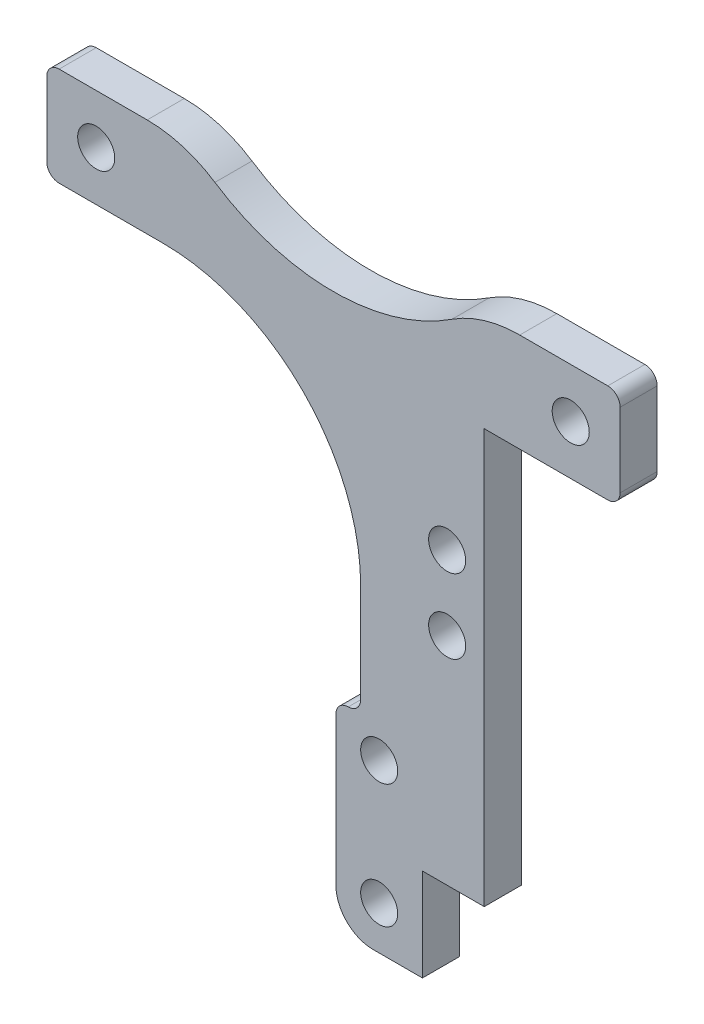
ISO-10303-21;
HEADER;
FILE_DESCRIPTION(('STEP AP214'),'2;1');
FILE_NAME('part.step','',(''),(''),'','','');
FILE_SCHEMA(('AUTOMOTIVE_DESIGN { 1 0 10303 214 1 1 1 1 }'));
ENDSEC;
DATA;
#1=APPLICATION_CONTEXT('core data for automotive mechanical design processes');
#2=APPLICATION_PROTOCOL_DEFINITION('international standard','automotive_design',2000,#1);
#3=PRODUCT_CONTEXT('',#1,'mechanical');
#4=PRODUCT('Part','Part','',(#3));
#5=PRODUCT_RELATED_PRODUCT_CATEGORY('part','',(#4));
#6=PRODUCT_DEFINITION_FORMATION('','',#4);
#7=PRODUCT_DEFINITION_CONTEXT('part definition',#1,'design');
#8=PRODUCT_DEFINITION('design','',#6,#7);
#9=PRODUCT_DEFINITION_SHAPE('','',#8);
#10=(LENGTH_UNIT() NAMED_UNIT(*) SI_UNIT(.MILLI.,.METRE.));
#11=(NAMED_UNIT(*) PLANE_ANGLE_UNIT() SI_UNIT($,.RADIAN.));
#12=(NAMED_UNIT(*) SI_UNIT($,.STERADIAN.) SOLID_ANGLE_UNIT());
#13=UNCERTAINTY_MEASURE_WITH_UNIT(LENGTH_MEASURE(1.E-05),#10,'distance_accuracy_value','');
#14=(GEOMETRIC_REPRESENTATION_CONTEXT(3) GLOBAL_UNCERTAINTY_ASSIGNED_CONTEXT((#13)) GLOBAL_UNIT_ASSIGNED_CONTEXT((#10,
#11,#12)) REPRESENTATION_CONTEXT('',''));
#15=CARTESIAN_POINT('',(0.,0.,0.));
#16=DIRECTION('',(0.,0.,1.));
#17=DIRECTION('',(1.,0.,0.));
#18=AXIS2_PLACEMENT_3D('',#15,#16,#17);
#19=CARTESIAN_POINT('',(11.,55.,3.));
#20=DIRECTION('',(0.,-1.,0.));
#21=DIRECTION('',(0.,0.,-1.));
#22=AXIS2_PLACEMENT_3D('',#19,#20,#21);
#23=PLANE('',#22);
#24=DIRECTION('',(-1.,0.,0.));
#25=VECTOR('',#24,1.);
#26=CARTESIAN_POINT('',(11.,55.,0.));
#27=LINE('',#26,#25);
#28=CARTESIAN_POINT('',(10.,55.,0.));
#29=VERTEX_POINT('',#28);
#30=CARTESIAN_POINT('',(2.87481343168134,55.,0.));
#31=VERTEX_POINT('',#30);
#32=EDGE_CURVE('E289',#29,#31,#27,.T.);
#33=ORIENTED_EDGE('',*,*,#32,.T.);
#34=DIRECTION('',(0.,0.,1.));
#35=VECTOR('',#34,1.);
#36=CARTESIAN_POINT('',(2.87481343168134,55.,3.));
#37=LINE('',#36,#35);
#38=CARTESIAN_POINT('',(2.87481343168134,55.,3.));
#39=VERTEX_POINT('',#38);
#40=EDGE_CURVE('E370',#31,#39,#37,.T.);
#41=ORIENTED_EDGE('',*,*,#40,.T.);
#42=DIRECTION('',(-1.,0.,0.));
#43=VECTOR('',#42,1.);
#44=CARTESIAN_POINT('',(11.,55.,3.));
#45=LINE('',#44,#43);
#46=CARTESIAN_POINT('',(10.,55.,3.));
#47=VERTEX_POINT('',#46);
#48=EDGE_CURVE('E263',#47,#39,#45,.T.);
#49=ORIENTED_EDGE('',*,*,#48,.F.);
#50=DIRECTION('',(0.,0.,-1.));
#51=VECTOR('',#50,1.);
#52=CARTESIAN_POINT('',(10.,55.,3.));
#53=LINE('',#52,#51);
#54=EDGE_CURVE('E310',#47,#29,#53,.T.);
#55=ORIENTED_EDGE('',*,*,#54,.T.);
#56=EDGE_LOOP('',(#33,#41,#49,#55));
#57=FACE_BOUND('',#56,.T.);
#58=ADVANCED_FACE('F34',(#57),#23,.F.);
#59=CARTESIAN_POINT('',(0.,0.,3.));
#60=DIRECTION('',(0.,0.,-1.));
#61=DIRECTION('',(-1.,0.,0.));
#62=AXIS2_PLACEMENT_3D('',#59,#60,#61);
#63=PLANE('',#62);
#64=CARTESIAN_POINT('',(-3.00000000002149,30.9999999999888,3.));
#65=DIRECTION('',(0.,0.,1.));
#66=DIRECTION('',(1.,0.,0.));
#67=AXIS2_PLACEMENT_3D('',#64,#65,#66);
#68=CIRCLE('',#67,1.5);
#69=CARTESIAN_POINT('',(-1.50000000002149,30.9999999999888,3.));
#70=VERTEX_POINT('',#69);
#71=EDGE_CURVE('E393',#70,#70,#68,.T.);
#72=ORIENTED_EDGE('',*,*,#71,.F.);
#73=EDGE_LOOP('',(#72));
#74=FACE_BOUND('',#73,.T.);
#75=CARTESIAN_POINT('',(-3.00000000002151,36.9999999999888,3.));
#76=DIRECTION('',(0.,0.,1.));
#77=DIRECTION('',(1.,0.,0.));
#78=AXIS2_PLACEMENT_3D('',#75,#76,#77);
#79=CIRCLE('',#78,1.5);
#80=CARTESIAN_POINT('',(-1.50000000002152,36.9999999999888,3.));
#81=VERTEX_POINT('',#80);
#82=EDGE_CURVE('E219',#81,#81,#79,.T.);
#83=ORIENTED_EDGE('',*,*,#82,.F.);
#84=EDGE_LOOP('',(#83));
#85=FACE_BOUND('',#84,.T.);
#86=DIRECTION('',(0.,-1.,0.));
#87=VECTOR('',#86,1.);
#88=CARTESIAN_POINT('',(-12.,7.,3.));
#89=LINE('',#88,#87);
#90=CARTESIAN_POINT('',(-12.,21.,3.));
#91=VERTEX_POINT('',#90);
#92=CARTESIAN_POINT('',(-12.,9.,3.));
#93=VERTEX_POINT('',#92);
#94=EDGE_CURVE('E274',#91,#93,#89,.T.);
#95=ORIENTED_EDGE('',*,*,#94,.T.);
#96=CARTESIAN_POINT('',(-9.,9.,3.));
#97=DIRECTION('',(0.,0.,-1.));
#98=DIRECTION('',(-1.,0.,0.));
#99=AXIS2_PLACEMENT_3D('',#96,#97,#98);
#100=CIRCLE('',#99,3.);
#101=CARTESIAN_POINT('',(-9.,6.,3.));
#102=VERTEX_POINT('',#101);
#103=EDGE_CURVE('E11',#93,#102,#100,.F.);
#104=ORIENTED_EDGE('',*,*,#103,.T.);
#105=DIRECTION('',(-1.,0.,0.));
#106=VECTOR('',#105,1.);
#107=CARTESIAN_POINT('',(-5.,6.,3.));
#108=LINE('',#107,#106);
#109=CARTESIAN_POINT('',(-5.,6.,3.));
#110=VERTEX_POINT('',#109);
#111=EDGE_CURVE('E208',#110,#102,#108,.T.);
#112=ORIENTED_EDGE('',*,*,#111,.F.);
#113=DIRECTION('',(0.,1.,0.));
#114=VECTOR('',#113,1.);
#115=CARTESIAN_POINT('',(-5.,3.5,3.));
#116=LINE('',#115,#114);
#117=CARTESIAN_POINT('',(-5.,13.5,3.));
#118=VERTEX_POINT('',#117);
#119=EDGE_CURVE('E191',#110,#118,#116,.T.);
#120=ORIENTED_EDGE('',*,*,#119,.T.);
#121=DIRECTION('',(1.,0.,0.));
#122=VECTOR('',#121,1.);
#123=CARTESIAN_POINT('',(-5.,13.5,3.));
#124=LINE('',#123,#122);
#125=CARTESIAN_POINT('',(0.,13.5,3.));
#126=VERTEX_POINT('',#125);
#127=EDGE_CURVE('E201',#118,#126,#124,.T.);
#128=ORIENTED_EDGE('',*,*,#127,.T.);
#129=DIRECTION('',(0.,1.,0.));
#130=VECTOR('',#129,1.);
#131=CARTESIAN_POINT('',(0.,13.5,3.));
#132=LINE('',#131,#130);
#133=CARTESIAN_POINT('',(0.,47.,3.));
#134=VERTEX_POINT('',#133);
#135=EDGE_CURVE('E254',#126,#134,#132,.T.);
#136=ORIENTED_EDGE('',*,*,#135,.T.);
#137=DIRECTION('',(1.,0.,0.));
#138=VECTOR('',#137,1.);
#139=CARTESIAN_POINT('',(0.,47.,3.));
#140=LINE('',#139,#138);
#141=CARTESIAN_POINT('',(10.,47.,3.));
#142=VERTEX_POINT('',#141);
#143=EDGE_CURVE('E256',#134,#142,#140,.T.);
#144=ORIENTED_EDGE('',*,*,#143,.T.);
#145=CARTESIAN_POINT('',(10.,48.,3.));
#146=DIRECTION('',(0.,0.,-1.));
#147=DIRECTION('',(-1.,0.,0.));
#148=AXIS2_PLACEMENT_3D('',#145,#146,#147);
#149=CIRCLE('',#148,1.);
#150=CARTESIAN_POINT('',(11.,48.,3.));
#151=VERTEX_POINT('',#150);
#152=EDGE_CURVE('E335',#142,#151,#149,.F.);
#153=ORIENTED_EDGE('',*,*,#152,.T.);
#154=DIRECTION('',(0.,1.,0.));
#155=VECTOR('',#154,1.);
#156=CARTESIAN_POINT('',(11.,47.,3.));
#157=LINE('',#156,#155);
#158=CARTESIAN_POINT('',(11.,54.,3.));
#159=VERTEX_POINT('',#158);
#160=EDGE_CURVE('E259',#151,#159,#157,.T.);
#161=ORIENTED_EDGE('',*,*,#160,.T.);
#162=CARTESIAN_POINT('',(10.,54.,3.));
#163=DIRECTION('',(0.,0.,-1.));
#164=DIRECTION('',(-1.,0.,0.));
#165=AXIS2_PLACEMENT_3D('',#162,#163,#164);
#166=CIRCLE('',#165,1.);
#167=EDGE_CURVE('E337',#159,#47,#166,.F.);
#168=ORIENTED_EDGE('',*,*,#167,.T.);
#169=ORIENTED_EDGE('',*,*,#48,.T.);
#170=CARTESIAN_POINT('',(2.87481343168134,45.,3.));
#171=DIRECTION('',(0.,0.,-1.));
#172=DIRECTION('',(-1.,0.,0.));
#173=AXIS2_PLACEMENT_3D('',#170,#171,#172);
#174=CIRCLE('',#173,10.);
#175=CARTESIAN_POINT('',(-2.60693690711188,53.3636363636364,3.));
#176=VERTEX_POINT('',#175);
#177=EDGE_CURVE('E375',#39,#176,#174,.F.);
#178=ORIENTED_EDGE('',*,*,#177,.T.);
#179=CARTESIAN_POINT('',(-12.2,68.,3.));
#180=DIRECTION('',(0.,0.,1.));
#181=DIRECTION('',(1.,0.,0.));
#182=AXIS2_PLACEMENT_3D('',#179,#180,#181);
#183=CIRCLE('',#182,17.5);
#184=CARTESIAN_POINT('',(-21.7930630928881,53.3636363636364,3.));
#185=VERTEX_POINT('',#184);
#186=EDGE_CURVE('E211',#185,#176,#183,.T.);
#187=ORIENTED_EDGE('',*,*,#186,.F.);
#188=CARTESIAN_POINT('',(-27.2748134316813,45.,3.));
#189=DIRECTION('',(0.,0.,-1.));
#190=DIRECTION('',(-1.,0.,0.));
#191=AXIS2_PLACEMENT_3D('',#188,#189,#190);
#192=CIRCLE('',#191,10.);
#193=CARTESIAN_POINT('',(-27.2748134316813,55.,3.));
#194=VERTEX_POINT('',#193);
#195=EDGE_CURVE('E373',#185,#194,#192,.F.);
#196=ORIENTED_EDGE('',*,*,#195,.T.);
#197=CARTESIAN_POINT('',(-34.4,55.,3.));
#198=VERTEX_POINT('',#197);
#199=EDGE_CURVE('E262',#194,#198,#45,.T.);
#200=ORIENTED_EDGE('',*,*,#199,.T.);
#201=CARTESIAN_POINT('',(-34.4,54.,3.));
#202=DIRECTION('',(0.,0.,-1.));
#203=DIRECTION('',(-1.,0.,0.));
#204=AXIS2_PLACEMENT_3D('',#201,#202,#203);
#205=CIRCLE('',#204,1.);
#206=CARTESIAN_POINT('',(-35.4,54.,3.));
#207=VERTEX_POINT('',#206);
#208=EDGE_CURVE('E331',#198,#207,#205,.F.);
#209=ORIENTED_EDGE('',*,*,#208,.T.);
#210=DIRECTION('',(0.,-1.,0.));
#211=VECTOR('',#210,1.);
#212=CARTESIAN_POINT('',(-35.4,55.,3.));
#213=LINE('',#212,#211);
#214=CARTESIAN_POINT('',(-35.4,48.,3.));
#215=VERTEX_POINT('',#214);
#216=EDGE_CURVE('E266',#207,#215,#213,.T.);
#217=ORIENTED_EDGE('',*,*,#216,.T.);
#218=CARTESIAN_POINT('',(-34.4,48.,3.));
#219=DIRECTION('',(0.,0.,-1.));
#220=DIRECTION('',(-1.,0.,0.));
#221=AXIS2_PLACEMENT_3D('',#218,#219,#220);
#222=CIRCLE('',#221,1.);
#223=CARTESIAN_POINT('',(-34.4,47.,3.));
#224=VERTEX_POINT('',#223);
#225=EDGE_CURVE('E333',#215,#224,#222,.F.);
#226=ORIENTED_EDGE('',*,*,#225,.T.);
#227=DIRECTION('',(1.,0.,0.));
#228=VECTOR('',#227,1.);
#229=CARTESIAN_POINT('',(-10.,47.,3.));
#230=LINE('',#229,#228);
#231=CARTESIAN_POINT('',(-26.,47.,3.));
#232=VERTEX_POINT('',#231);
#233=EDGE_CURVE('E269',#224,#232,#230,.T.);
#234=ORIENTED_EDGE('',*,*,#233,.T.);
#235=CARTESIAN_POINT('',(-26.,31.,3.));
#236=DIRECTION('',(0.,0.,-1.));
#237=DIRECTION('',(-1.,0.,0.));
#238=AXIS2_PLACEMENT_3D('',#235,#236,#237);
#239=CIRCLE('',#238,16.);
#240=CARTESIAN_POINT('',(-10.,31.,3.));
#241=VERTEX_POINT('',#240);
#242=EDGE_CURVE('E368',#232,#241,#239,.T.);
#243=ORIENTED_EDGE('',*,*,#242,.T.);
#244=DIRECTION('',(0.,-1.,0.));
#245=VECTOR('',#244,1.);
#246=CARTESIAN_POINT('',(-10.,22.,3.));
#247=LINE('',#246,#245);
#248=CARTESIAN_POINT('',(-10.,23.,3.));
#249=VERTEX_POINT('',#248);
#250=EDGE_CURVE('E272',#241,#249,#247,.T.);
#251=ORIENTED_EDGE('',*,*,#250,.T.);
#252=CARTESIAN_POINT('',(-11.,23.,3.));
#253=DIRECTION('',(0.,0.,-1.));
#254=DIRECTION('',(-1.,0.,0.));
#255=AXIS2_PLACEMENT_3D('',#252,#253,#254);
#256=CIRCLE('',#255,1.);
#257=CARTESIAN_POINT('',(-11.,22.,3.));
#258=VERTEX_POINT('',#257);
#259=EDGE_CURVE('E357',#249,#258,#256,.T.);
#260=ORIENTED_EDGE('',*,*,#259,.T.);
#261=CARTESIAN_POINT('',(-11.,21.,3.));
#262=DIRECTION('',(0.,0.,-1.));
#263=DIRECTION('',(-1.,0.,0.));
#264=AXIS2_PLACEMENT_3D('',#261,#262,#263);
#265=CIRCLE('',#264,1.);
#266=EDGE_CURVE('E329',#258,#91,#265,.F.);
#267=ORIENTED_EDGE('',*,*,#266,.T.);
#268=EDGE_LOOP('',(#95,#104,#112,#120,#128,#136,#144,#153,#161,#168,#169,#178,#187,#196,#200,
#209,#217,#226,#234,#243,#251,#260,#267));
#269=FACE_BOUND('',#268,.T.);
#270=CARTESIAN_POINT('',(7.,51.,3.));
#271=DIRECTION('',(0.,0.,1.));
#272=DIRECTION('',(1.,0.,0.));
#273=AXIS2_PLACEMENT_3D('',#270,#271,#272);
#274=CIRCLE('',#273,1.5);
#275=CARTESIAN_POINT('',(8.5,51.,3.));
#276=VERTEX_POINT('',#275);
#277=EDGE_CURVE('E247',#276,#276,#274,.T.);
#278=ORIENTED_EDGE('',*,*,#277,.F.);
#279=EDGE_LOOP('',(#278));
#280=FACE_BOUND('',#279,.T.);
#281=CARTESIAN_POINT('',(-31.4,51.,3.));
#282=DIRECTION('',(0.,0.,1.));
#283=DIRECTION('',(1.,0.,0.));
#284=AXIS2_PLACEMENT_3D('',#281,#282,#283);
#285=CIRCLE('',#284,1.5);
#286=CARTESIAN_POINT('',(-29.9,51.,3.));
#287=VERTEX_POINT('',#286);
#288=EDGE_CURVE('E241',#287,#287,#285,.T.);
#289=ORIENTED_EDGE('',*,*,#288,.F.);
#290=EDGE_LOOP('',(#289));
#291=FACE_BOUND('',#290,.T.);
#292=CARTESIAN_POINT('',(-8.5,19.5,3.));
#293=DIRECTION('',(0.,0.,1.));
#294=DIRECTION('',(1.,0.,0.));
#295=AXIS2_PLACEMENT_3D('',#292,#293,#294);
#296=CIRCLE('',#295,1.5);
#297=CARTESIAN_POINT('',(-7.,19.5,3.));
#298=VERTEX_POINT('',#297);
#299=EDGE_CURVE('E235',#298,#298,#296,.T.);
#300=ORIENTED_EDGE('',*,*,#299,.F.);
#301=EDGE_LOOP('',(#300));
#302=FACE_BOUND('',#301,.T.);
#303=CARTESIAN_POINT('',(-8.5,9.5,3.));
#304=DIRECTION('',(0.,0.,1.));
#305=DIRECTION('',(1.,0.,0.));
#306=AXIS2_PLACEMENT_3D('',#303,#304,#305);
#307=CIRCLE('',#306,1.5);
#308=CARTESIAN_POINT('',(-7.,9.5,3.));
#309=VERTEX_POINT('',#308);
#310=EDGE_CURVE('E228',#309,#309,#307,.T.);
#311=ORIENTED_EDGE('',*,*,#310,.F.);
#312=EDGE_LOOP('',(#311));
#313=FACE_BOUND('',#312,.T.);
#314=ADVANCED_FACE('F213',(#74,#85,#269,#280,#291,#302,#313),#63,.F.);
#315=CARTESIAN_POINT('',(0.,0.,0.));
#316=DIRECTION('',(0.,0.,-1.));
#317=DIRECTION('',(-1.,0.,0.));
#318=AXIS2_PLACEMENT_3D('',#315,#316,#317);
#319=PLANE('',#318);
#320=CARTESIAN_POINT('',(-3.00000000002149,30.9999999999888,0.));
#321=DIRECTION('',(0.,0.,-1.));
#322=DIRECTION('',(-1.,0.,0.));
#323=AXIS2_PLACEMENT_3D('',#320,#321,#322);
#324=CIRCLE('',#323,1.5);
#325=CARTESIAN_POINT('',(-4.50000000002149,30.9999999999888,0.));
#326=VERTEX_POINT('',#325);
#327=EDGE_CURVE('E38',#326,#326,#324,.T.);
#328=ORIENTED_EDGE('',*,*,#327,.F.);
#329=EDGE_LOOP('',(#328));
#330=FACE_BOUND('',#329,.T.);
#331=CARTESIAN_POINT('',(-3.00000000002151,36.9999999999888,0.));
#332=DIRECTION('',(0.,0.,-1.));
#333=DIRECTION('',(-1.,0.,0.));
#334=AXIS2_PLACEMENT_3D('',#331,#332,#333);
#335=CIRCLE('',#334,1.5);
#336=CARTESIAN_POINT('',(-4.50000000002151,36.9999999999888,0.));
#337=VERTEX_POINT('',#336);
#338=EDGE_CURVE('E391',#337,#337,#335,.T.);
#339=ORIENTED_EDGE('',*,*,#338,.F.);
#340=EDGE_LOOP('',(#339));
#341=FACE_BOUND('',#340,.T.);
#342=DIRECTION('',(-1.,0.,0.));
#343=VECTOR('',#342,1.);
#344=CARTESIAN_POINT('',(-5.,6.,0.));
#345=LINE('',#344,#343);
#346=CARTESIAN_POINT('',(-5.,6.,0.));
#347=VERTEX_POINT('',#346);
#348=CARTESIAN_POINT('',(-9.,6.,0.));
#349=VERTEX_POINT('',#348);
#350=EDGE_CURVE('E210',#347,#349,#345,.T.);
#351=ORIENTED_EDGE('',*,*,#350,.T.);
#352=CARTESIAN_POINT('',(-9.,9.,0.));
#353=DIRECTION('',(0.,0.,-1.));
#354=DIRECTION('',(-1.,0.,0.));
#355=AXIS2_PLACEMENT_3D('',#352,#353,#354);
#356=CIRCLE('',#355,3.);
#357=CARTESIAN_POINT('',(-12.,9.,0.));
#358=VERTEX_POINT('',#357);
#359=EDGE_CURVE('E58',#349,#358,#356,.T.);
#360=ORIENTED_EDGE('',*,*,#359,.T.);
#361=DIRECTION('',(0.,-1.,0.));
#362=VECTOR('',#361,1.);
#363=CARTESIAN_POINT('',(-12.,7.,0.));
#364=LINE('',#363,#362);
#365=CARTESIAN_POINT('',(-12.,21.,0.));
#366=VERTEX_POINT('',#365);
#367=EDGE_CURVE('E202',#366,#358,#364,.T.);
#368=ORIENTED_EDGE('',*,*,#367,.F.);
#369=CARTESIAN_POINT('',(-11.,21.,0.));
#370=DIRECTION('',(0.,0.,-1.));
#371=DIRECTION('',(-1.,0.,0.));
#372=AXIS2_PLACEMENT_3D('',#369,#370,#371);
#373=CIRCLE('',#372,1.);
#374=CARTESIAN_POINT('',(-11.,22.,0.));
#375=VERTEX_POINT('',#374);
#376=EDGE_CURVE('E313',#366,#375,#373,.T.);
#377=ORIENTED_EDGE('',*,*,#376,.T.);
#378=CARTESIAN_POINT('',(-11.,23.,0.));
#379=DIRECTION('',(0.,0.,-1.));
#380=DIRECTION('',(-1.,0.,0.));
#381=AXIS2_PLACEMENT_3D('',#378,#379,#380);
#382=CIRCLE('',#381,1.);
#383=CARTESIAN_POINT('',(-10.,23.,0.));
#384=VERTEX_POINT('',#383);
#385=EDGE_CURVE('E354',#375,#384,#382,.F.);
#386=ORIENTED_EDGE('',*,*,#385,.T.);
#387=DIRECTION('',(0.,-1.,0.));
#388=VECTOR('',#387,1.);
#389=CARTESIAN_POINT('',(-10.,22.,0.));
#390=LINE('',#389,#388);
#391=CARTESIAN_POINT('',(-10.,31.,0.));
#392=VERTEX_POINT('',#391);
#393=EDGE_CURVE('E298',#392,#384,#390,.T.);
#394=ORIENTED_EDGE('',*,*,#393,.F.);
#395=CARTESIAN_POINT('',(-26.,31.,0.));
#396=DIRECTION('',(0.,0.,-1.));
#397=DIRECTION('',(-1.,0.,0.));
#398=AXIS2_PLACEMENT_3D('',#395,#396,#397);
#399=CIRCLE('',#398,16.);
#400=CARTESIAN_POINT('',(-26.,47.,0.));
#401=VERTEX_POINT('',#400);
#402=EDGE_CURVE('E366',#392,#401,#399,.F.);
#403=ORIENTED_EDGE('',*,*,#402,.T.);
#404=DIRECTION('',(1.,0.,0.));
#405=VECTOR('',#404,1.);
#406=CARTESIAN_POINT('',(-10.,47.,0.));
#407=LINE('',#406,#405);
#408=CARTESIAN_POINT('',(-34.4,47.,0.));
#409=VERTEX_POINT('',#408);
#410=EDGE_CURVE('E295',#409,#401,#407,.T.);
#411=ORIENTED_EDGE('',*,*,#410,.F.);
#412=CARTESIAN_POINT('',(-34.4,48.,0.));
#413=DIRECTION('',(0.,0.,-1.));
#414=DIRECTION('',(-1.,0.,0.));
#415=AXIS2_PLACEMENT_3D('',#412,#413,#414);
#416=CIRCLE('',#415,1.);
#417=CARTESIAN_POINT('',(-35.4,48.,0.));
#418=VERTEX_POINT('',#417);
#419=EDGE_CURVE('E318',#409,#418,#416,.T.);
#420=ORIENTED_EDGE('',*,*,#419,.T.);
#421=DIRECTION('',(0.,-1.,0.));
#422=VECTOR('',#421,1.);
#423=CARTESIAN_POINT('',(-35.4,55.,0.));
#424=LINE('',#423,#422);
#425=CARTESIAN_POINT('',(-35.4,54.,0.));
#426=VERTEX_POINT('',#425);
#427=EDGE_CURVE('E292',#426,#418,#424,.T.);
#428=ORIENTED_EDGE('',*,*,#427,.F.);
#429=CARTESIAN_POINT('',(-34.4,54.,0.));
#430=DIRECTION('',(0.,0.,-1.));
#431=DIRECTION('',(-1.,0.,0.));
#432=AXIS2_PLACEMENT_3D('',#429,#430,#431);
#433=CIRCLE('',#432,1.);
#434=CARTESIAN_POINT('',(-34.4,55.,0.));
#435=VERTEX_POINT('',#434);
#436=EDGE_CURVE('E315',#426,#435,#433,.T.);
#437=ORIENTED_EDGE('',*,*,#436,.T.);
#438=CARTESIAN_POINT('',(-27.2748134316813,55.,0.));
#439=VERTEX_POINT('',#438);
#440=EDGE_CURVE('E288',#439,#435,#27,.T.);
#441=ORIENTED_EDGE('',*,*,#440,.F.);
#442=CARTESIAN_POINT('',(-27.2748134316813,45.,0.));
#443=DIRECTION('',(0.,0.,-1.));
#444=DIRECTION('',(-1.,0.,0.));
#445=AXIS2_PLACEMENT_3D('',#442,#443,#444);
#446=CIRCLE('',#445,10.);
#447=CARTESIAN_POINT('',(-21.7930630928881,53.3636363636364,0.));
#448=VERTEX_POINT('',#447);
#449=EDGE_CURVE('E381',#439,#448,#446,.T.);
#450=ORIENTED_EDGE('',*,*,#449,.T.);
#451=CARTESIAN_POINT('',(-12.2,68.,0.));
#452=DIRECTION('',(0.,0.,1.));
#453=DIRECTION('',(1.,0.,0.));
#454=AXIS2_PLACEMENT_3D('',#451,#452,#453);
#455=CIRCLE('',#454,17.5);
#456=CARTESIAN_POINT('',(-2.60693690711188,53.3636363636364,0.));
#457=VERTEX_POINT('',#456);
#458=EDGE_CURVE('E222',#448,#457,#455,.T.);
#459=ORIENTED_EDGE('',*,*,#458,.T.);
#460=CARTESIAN_POINT('',(2.87481343168134,45.,0.));
#461=DIRECTION('',(0.,0.,-1.));
#462=DIRECTION('',(-1.,0.,0.));
#463=AXIS2_PLACEMENT_3D('',#460,#461,#462);
#464=CIRCLE('',#463,10.);
#465=EDGE_CURVE('E383',#457,#31,#464,.T.);
#466=ORIENTED_EDGE('',*,*,#465,.T.);
#467=ORIENTED_EDGE('',*,*,#32,.F.);
#468=CARTESIAN_POINT('',(10.,54.,0.));
#469=DIRECTION('',(0.,0.,-1.));
#470=DIRECTION('',(-1.,0.,0.));
#471=AXIS2_PLACEMENT_3D('',#468,#469,#470);
#472=CIRCLE('',#471,1.);
#473=CARTESIAN_POINT('',(11.,54.,0.));
#474=VERTEX_POINT('',#473);
#475=EDGE_CURVE('E322',#29,#474,#472,.T.);
#476=ORIENTED_EDGE('',*,*,#475,.T.);
#477=DIRECTION('',(0.,1.,0.));
#478=VECTOR('',#477,1.);
#479=CARTESIAN_POINT('',(11.,47.,0.));
#480=LINE('',#479,#478);
#481=CARTESIAN_POINT('',(11.,48.,0.));
#482=VERTEX_POINT('',#481);
#483=EDGE_CURVE('E285',#482,#474,#480,.T.);
#484=ORIENTED_EDGE('',*,*,#483,.F.);
#485=CARTESIAN_POINT('',(10.,48.,0.));
#486=DIRECTION('',(0.,0.,-1.));
#487=DIRECTION('',(-1.,0.,0.));
#488=AXIS2_PLACEMENT_3D('',#485,#486,#487);
#489=CIRCLE('',#488,1.);
#490=CARTESIAN_POINT('',(10.,47.,0.));
#491=VERTEX_POINT('',#490);
#492=EDGE_CURVE('E320',#482,#491,#489,.T.);
#493=ORIENTED_EDGE('',*,*,#492,.T.);
#494=DIRECTION('',(1.,0.,0.));
#495=VECTOR('',#494,1.);
#496=CARTESIAN_POINT('',(0.,47.,0.));
#497=LINE('',#496,#495);
#498=CARTESIAN_POINT('',(0.,47.,0.));
#499=VERTEX_POINT('',#498);
#500=EDGE_CURVE('E282',#499,#491,#497,.T.);
#501=ORIENTED_EDGE('',*,*,#500,.F.);
#502=DIRECTION('',(0.,1.,0.));
#503=VECTOR('',#502,1.);
#504=CARTESIAN_POINT('',(0.,13.5,0.));
#505=LINE('',#504,#503);
#506=CARTESIAN_POINT('',(0.,13.5,0.));
#507=VERTEX_POINT('',#506);
#508=EDGE_CURVE('E280',#507,#499,#505,.T.);
#509=ORIENTED_EDGE('',*,*,#508,.F.);
#510=DIRECTION('',(1.,0.,0.));
#511=VECTOR('',#510,1.);
#512=CARTESIAN_POINT('',(-5.,13.5,0.));
#513=LINE('',#512,#511);
#514=CARTESIAN_POINT('',(-5.,13.5,0.));
#515=VERTEX_POINT('',#514);
#516=EDGE_CURVE('E278',#515,#507,#513,.T.);
#517=ORIENTED_EDGE('',*,*,#516,.F.);
#518=DIRECTION('',(0.,1.,0.));
#519=VECTOR('',#518,1.);
#520=CARTESIAN_POINT('',(-5.,3.5,0.));
#521=LINE('',#520,#519);
#522=EDGE_CURVE('E250',#347,#515,#521,.T.);
#523=ORIENTED_EDGE('',*,*,#522,.F.);
#524=EDGE_LOOP('',(#351,#360,#368,#377,#386,#394,#403,#411,#420,#428,#437,#441,#450,#459,#466,
#467,#476,#484,#493,#501,#509,#517,#523));
#525=FACE_BOUND('',#524,.T.);
#526=CARTESIAN_POINT('',(-8.5,19.5,0.));
#527=DIRECTION('',(0.,0.,1.));
#528=DIRECTION('',(1.,0.,0.));
#529=AXIS2_PLACEMENT_3D('',#526,#527,#528);
#530=CIRCLE('',#529,1.5);
#531=CARTESIAN_POINT('',(-7.,19.5,0.));
#532=VERTEX_POINT('',#531);
#533=EDGE_CURVE('E231',#532,#532,#530,.T.);
#534=ORIENTED_EDGE('',*,*,#533,.T.);
#535=EDGE_LOOP('',(#534));
#536=FACE_BOUND('',#535,.T.);
#537=CARTESIAN_POINT('',(7.,51.,0.));
#538=DIRECTION('',(0.,0.,1.));
#539=DIRECTION('',(1.,0.,0.));
#540=AXIS2_PLACEMENT_3D('',#537,#538,#539);
#541=CIRCLE('',#540,1.5);
#542=CARTESIAN_POINT('',(8.5,51.,0.));
#543=VERTEX_POINT('',#542);
#544=EDGE_CURVE('E244',#543,#543,#541,.T.);
#545=ORIENTED_EDGE('',*,*,#544,.T.);
#546=EDGE_LOOP('',(#545));
#547=FACE_BOUND('',#546,.T.);
#548=CARTESIAN_POINT('',(-31.4,51.,0.));
#549=DIRECTION('',(0.,0.,1.));
#550=DIRECTION('',(1.,0.,0.));
#551=AXIS2_PLACEMENT_3D('',#548,#549,#550);
#552=CIRCLE('',#551,1.5);
#553=CARTESIAN_POINT('',(-29.9,51.,0.));
#554=VERTEX_POINT('',#553);
#555=EDGE_CURVE('E238',#554,#554,#552,.T.);
#556=ORIENTED_EDGE('',*,*,#555,.T.);
#557=EDGE_LOOP('',(#556));
#558=FACE_BOUND('',#557,.T.);
#559=CARTESIAN_POINT('',(-8.5,9.5,0.));
#560=DIRECTION('',(0.,0.,1.));
#561=DIRECTION('',(1.,0.,0.));
#562=AXIS2_PLACEMENT_3D('',#559,#560,#561);
#563=CIRCLE('',#562,1.5);
#564=CARTESIAN_POINT('',(-7.,9.5,0.));
#565=VERTEX_POINT('',#564);
#566=EDGE_CURVE('E232',#565,#565,#563,.T.);
#567=ORIENTED_EDGE('',*,*,#566,.T.);
#568=EDGE_LOOP('',(#567));
#569=FACE_BOUND('',#568,.T.);
#570=ADVANCED_FACE('F406',(#330,#341,#525,#536,#547,#558,#569),#319,.T.);
#571=CARTESIAN_POINT('',(-5.,3.5,3.));
#572=DIRECTION('',(-1.,0.,0.));
#573=DIRECTION('',(0.,0.,1.));
#574=AXIS2_PLACEMENT_3D('',#571,#572,#573);
#575=PLANE('',#574);
#576=ORIENTED_EDGE('',*,*,#119,.F.);
#577=DIRECTION('',(0.,0.,-1.));
#578=VECTOR('',#577,1.);
#579=CARTESIAN_POINT('',(-5.,6.,3.));
#580=LINE('',#579,#578);
#581=EDGE_CURVE('E194',#110,#347,#580,.T.);
#582=ORIENTED_EDGE('',*,*,#581,.T.);
#583=ORIENTED_EDGE('',*,*,#522,.T.);
#584=DIRECTION('',(0.,0.,-1.));
#585=VECTOR('',#584,1.);
#586=CARTESIAN_POINT('',(-5.,13.5,3.));
#587=LINE('',#586,#585);
#588=EDGE_CURVE('E197',#118,#515,#587,.T.);
#589=ORIENTED_EDGE('',*,*,#588,.F.);
#590=EDGE_LOOP('',(#576,#582,#583,#589));
#591=FACE_BOUND('',#590,.T.);
#592=ADVANCED_FACE('F193',(#591),#575,.F.);
#593=CARTESIAN_POINT('',(-5.,13.5,3.));
#594=DIRECTION('',(0.,1.,0.));
#595=DIRECTION('',(0.,0.,1.));
#596=AXIS2_PLACEMENT_3D('',#593,#594,#595);
#597=PLANE('',#596);
#598=ORIENTED_EDGE('',*,*,#516,.T.);
#599=DIRECTION('',(0.,0.,-1.));
#600=VECTOR('',#599,1.);
#601=CARTESIAN_POINT('',(0.,13.5,3.));
#602=LINE('',#601,#600);
#603=EDGE_CURVE('E303',#126,#507,#602,.T.);
#604=ORIENTED_EDGE('',*,*,#603,.F.);
#605=ORIENTED_EDGE('',*,*,#127,.F.);
#606=ORIENTED_EDGE('',*,*,#588,.T.);
#607=EDGE_LOOP('',(#598,#604,#605,#606));
#608=FACE_BOUND('',#607,.T.);
#609=ADVANCED_FACE('F450',(#608),#597,.F.);
#610=CARTESIAN_POINT('',(0.,13.5,3.));
#611=DIRECTION('',(-1.,0.,0.));
#612=DIRECTION('',(0.,0.,1.));
#613=AXIS2_PLACEMENT_3D('',#610,#611,#612);
#614=PLANE('',#613);
#615=ORIENTED_EDGE('',*,*,#508,.T.);
#616=DIRECTION('',(0.,0.,-1.));
#617=VECTOR('',#616,1.);
#618=CARTESIAN_POINT('',(0.,47.,3.));
#619=LINE('',#618,#617);
#620=EDGE_CURVE('E276',#134,#499,#619,.T.);
#621=ORIENTED_EDGE('',*,*,#620,.F.);
#622=ORIENTED_EDGE('',*,*,#135,.F.);
#623=ORIENTED_EDGE('',*,*,#603,.T.);
#624=EDGE_LOOP('',(#615,#621,#622,#623));
#625=FACE_BOUND('',#624,.T.);
#626=ADVANCED_FACE('F446',(#625),#614,.F.);
#627=CARTESIAN_POINT('',(0.,47.,3.));
#628=DIRECTION('',(0.,1.,0.));
#629=DIRECTION('',(0.,0.,1.));
#630=AXIS2_PLACEMENT_3D('',#627,#628,#629);
#631=PLANE('',#630);
#632=ORIENTED_EDGE('',*,*,#500,.T.);
#633=DIRECTION('',(0.,0.,-1.));
#634=VECTOR('',#633,1.);
#635=CARTESIAN_POINT('',(10.,47.,3.));
#636=LINE('',#635,#634);
#637=EDGE_CURVE('E339',#491,#142,#636,.F.);
#638=ORIENTED_EDGE('',*,*,#637,.T.);
#639=ORIENTED_EDGE('',*,*,#143,.F.);
#640=ORIENTED_EDGE('',*,*,#620,.T.);
#641=EDGE_LOOP('',(#632,#638,#639,#640));
#642=FACE_BOUND('',#641,.T.);
#643=ADVANCED_FACE('F442',(#642),#631,.F.);
#644=CARTESIAN_POINT('',(11.,47.,3.));
#645=DIRECTION('',(-1.,0.,0.));
#646=DIRECTION('',(0.,-1.,0.));
#647=AXIS2_PLACEMENT_3D('',#644,#645,#646);
#648=PLANE('',#647);
#649=ORIENTED_EDGE('',*,*,#483,.T.);
#650=DIRECTION('',(0.,0.,-1.));
#651=VECTOR('',#650,1.);
#652=CARTESIAN_POINT('',(11.,54.,3.));
#653=LINE('',#652,#651);
#654=EDGE_CURVE('E327',#474,#159,#653,.F.);
#655=ORIENTED_EDGE('',*,*,#654,.T.);
#656=ORIENTED_EDGE('',*,*,#160,.F.);
#657=DIRECTION('',(0.,0.,-1.));
#658=VECTOR('',#657,1.);
#659=CARTESIAN_POINT('',(11.,48.,3.));
#660=LINE('',#659,#658);
#661=EDGE_CURVE('E324',#151,#482,#660,.T.);
#662=ORIENTED_EDGE('',*,*,#661,.T.);
#663=EDGE_LOOP('',(#649,#655,#656,#662));
#664=FACE_BOUND('',#663,.T.);
#665=ADVANCED_FACE('F438',(#664),#648,.F.);
#666=ORIENTED_EDGE('',*,*,#199,.F.);
#667=DIRECTION('',(0.,0.,1.));
#668=VECTOR('',#667,1.);
#669=CARTESIAN_POINT('',(-27.2748134316813,55.,3.));
#670=LINE('',#669,#668);
#671=EDGE_CURVE('E385',#194,#439,#670,.F.);
#672=ORIENTED_EDGE('',*,*,#671,.T.);
#673=ORIENTED_EDGE('',*,*,#440,.T.);
#674=DIRECTION('',(0.,0.,-1.));
#675=VECTOR('',#674,1.);
#676=CARTESIAN_POINT('',(-34.4,55.,3.));
#677=LINE('',#676,#675);
#678=EDGE_CURVE('E307',#435,#198,#677,.F.);
#679=ORIENTED_EDGE('',*,*,#678,.T.);
#680=EDGE_LOOP('',(#666,#672,#673,#679));
#681=FACE_BOUND('',#680,.T.);
#682=ADVANCED_FACE('F417',(#681),#23,.F.);
#683=CARTESIAN_POINT('',(-35.4,55.,3.));
#684=DIRECTION('',(1.,0.,0.));
#685=DIRECTION('',(0.,1.,0.));
#686=AXIS2_PLACEMENT_3D('',#683,#684,#685);
#687=PLANE('',#686);
#688=ORIENTED_EDGE('',*,*,#427,.T.);
#689=DIRECTION('',(0.,0.,-1.));
#690=VECTOR('',#689,1.);
#691=CARTESIAN_POINT('',(-35.4,48.,3.));
#692=LINE('',#691,#690);
#693=EDGE_CURVE('E347',#418,#215,#692,.F.);
#694=ORIENTED_EDGE('',*,*,#693,.T.);
#695=ORIENTED_EDGE('',*,*,#216,.F.);
#696=DIRECTION('',(0.,0.,-1.));
#697=VECTOR('',#696,1.);
#698=CARTESIAN_POINT('',(-35.4,54.,3.));
#699=LINE('',#698,#697);
#700=EDGE_CURVE('E344',#207,#426,#699,.T.);
#701=ORIENTED_EDGE('',*,*,#700,.T.);
#702=EDGE_LOOP('',(#688,#694,#695,#701));
#703=FACE_BOUND('',#702,.T.);
#704=ADVANCED_FACE('F432',(#703),#687,.F.);
#705=CARTESIAN_POINT('',(-10.,47.,3.));
#706=DIRECTION('',(0.,1.,0.));
#707=DIRECTION('',(0.,0.,1.));
#708=AXIS2_PLACEMENT_3D('',#705,#706,#707);
#709=PLANE('',#708);
#710=ORIENTED_EDGE('',*,*,#410,.T.);
#711=DIRECTION('',(0.,0.,-1.));
#712=VECTOR('',#711,1.);
#713=CARTESIAN_POINT('',(-26.,47.,3.));
#714=LINE('',#713,#712);
#715=EDGE_CURVE('E364',#401,#232,#714,.F.);
#716=ORIENTED_EDGE('',*,*,#715,.T.);
#717=ORIENTED_EDGE('',*,*,#233,.F.);
#718=DIRECTION('',(0.,0.,-1.));
#719=VECTOR('',#718,1.);
#720=CARTESIAN_POINT('',(-34.4,47.,3.));
#721=LINE('',#720,#719);
#722=EDGE_CURVE('E341',#224,#409,#721,.T.);
#723=ORIENTED_EDGE('',*,*,#722,.T.);
#724=EDGE_LOOP('',(#710,#716,#717,#723));
#725=FACE_BOUND('',#724,.T.);
#726=ADVANCED_FACE('F428',(#725),#709,.F.);
#727=CARTESIAN_POINT('',(-10.,22.,3.));
#728=DIRECTION('',(1.,0.,0.));
#729=DIRECTION('',(0.,0.,-1.));
#730=AXIS2_PLACEMENT_3D('',#727,#728,#729);
#731=PLANE('',#730);
#732=ORIENTED_EDGE('',*,*,#250,.F.);
#733=DIRECTION('',(0.,0.,-1.));
#734=VECTOR('',#733,1.);
#735=CARTESIAN_POINT('',(-10.,31.,0.));
#736=LINE('',#735,#734);
#737=EDGE_CURVE('E359',#241,#392,#736,.T.);
#738=ORIENTED_EDGE('',*,*,#737,.T.);
#739=ORIENTED_EDGE('',*,*,#393,.T.);
#740=DIRECTION('',(0.,0.,-1.));
#741=VECTOR('',#740,1.);
#742=CARTESIAN_POINT('',(-10.,23.,3.));
#743=LINE('',#742,#741);
#744=EDGE_CURVE('E349',#384,#249,#743,.F.);
#745=ORIENTED_EDGE('',*,*,#744,.T.);
#746=EDGE_LOOP('',(#732,#738,#739,#745));
#747=FACE_BOUND('',#746,.T.);
#748=ADVANCED_FACE('F425',(#747),#731,.F.);
#749=CARTESIAN_POINT('',(-12.,7.,3.));
#750=DIRECTION('',(1.,0.,0.));
#751=DIRECTION('',(0.,0.,-1.));
#752=AXIS2_PLACEMENT_3D('',#749,#750,#751);
#753=PLANE('',#752);
#754=ORIENTED_EDGE('',*,*,#367,.T.);
#755=DIRECTION('',(0.,0.,-1.));
#756=VECTOR('',#755,1.);
#757=CARTESIAN_POINT('',(-12.,9.,3.));
#758=LINE('',#757,#756);
#759=EDGE_CURVE('E43',#358,#93,#758,.F.);
#760=ORIENTED_EDGE('',*,*,#759,.T.);
#761=ORIENTED_EDGE('',*,*,#94,.F.);
#762=DIRECTION('',(0.,0.,-1.));
#763=VECTOR('',#762,1.);
#764=CARTESIAN_POINT('',(-12.,21.,3.));
#765=LINE('',#764,#763);
#766=EDGE_CURVE('E352',#91,#366,#765,.T.);
#767=ORIENTED_EDGE('',*,*,#766,.T.);
#768=EDGE_LOOP('',(#754,#760,#761,#767));
#769=FACE_BOUND('',#768,.T.);
#770=ADVANCED_FACE('F422',(#769),#753,.F.);
#771=CARTESIAN_POINT('',(7.,51.,3.));
#772=DIRECTION('',(0.,0.,-1.));
#773=DIRECTION('',(-1.,0.,0.));
#774=AXIS2_PLACEMENT_3D('',#771,#772,#773);
#775=CYLINDRICAL_SURFACE('',#774,1.5);
#776=ORIENTED_EDGE('',*,*,#277,.T.);
#777=EDGE_LOOP('',(#776));
#778=FACE_BOUND('',#777,.T.);
#779=ORIENTED_EDGE('',*,*,#544,.F.);
#780=EDGE_LOOP('',(#779));
#781=FACE_BOUND('',#780,.T.);
#782=ADVANCED_FACE('F419',(#778,#781),#775,.F.);
#783=CARTESIAN_POINT('',(-31.4,51.,3.));
#784=DIRECTION('',(0.,0.,-1.));
#785=DIRECTION('',(-1.,0.,0.));
#786=AXIS2_PLACEMENT_3D('',#783,#784,#785);
#787=CYLINDRICAL_SURFACE('',#786,1.5);
#788=ORIENTED_EDGE('',*,*,#288,.T.);
#789=EDGE_LOOP('',(#788));
#790=FACE_BOUND('',#789,.T.);
#791=ORIENTED_EDGE('',*,*,#555,.F.);
#792=EDGE_LOOP('',(#791));
#793=FACE_BOUND('',#792,.T.);
#794=ADVANCED_FACE('F559',(#790,#793),#787,.F.);
#795=CARTESIAN_POINT('',(-8.5,19.5,3.));
#796=DIRECTION('',(0.,0.,-1.));
#797=DIRECTION('',(-1.,0.,0.));
#798=AXIS2_PLACEMENT_3D('',#795,#796,#797);
#799=CYLINDRICAL_SURFACE('',#798,1.5);
#800=ORIENTED_EDGE('',*,*,#299,.T.);
#801=EDGE_LOOP('',(#800));
#802=FACE_BOUND('',#801,.T.);
#803=ORIENTED_EDGE('',*,*,#533,.F.);
#804=EDGE_LOOP('',(#803));
#805=FACE_BOUND('',#804,.T.);
#806=ADVANCED_FACE('F556',(#802,#805),#799,.F.);
#807=CARTESIAN_POINT('',(-8.5,9.5,3.));
#808=DIRECTION('',(0.,0.,-1.));
#809=DIRECTION('',(-1.,0.,0.));
#810=AXIS2_PLACEMENT_3D('',#807,#808,#809);
#811=CYLINDRICAL_SURFACE('',#810,1.5);
#812=ORIENTED_EDGE('',*,*,#310,.T.);
#813=EDGE_LOOP('',(#812));
#814=FACE_BOUND('',#813,.T.);
#815=ORIENTED_EDGE('',*,*,#566,.F.);
#816=EDGE_LOOP('',(#815));
#817=FACE_BOUND('',#816,.T.);
#818=ADVANCED_FACE('F461',(#814,#817),#811,.F.);
#819=CARTESIAN_POINT('',(10.,54.,3.));
#820=DIRECTION('',(0.,0.,-1.));
#821=DIRECTION('',(-1.,0.,0.));
#822=AXIS2_PLACEMENT_3D('',#819,#820,#821);
#823=CYLINDRICAL_SURFACE('',#822,1.);
#824=ORIENTED_EDGE('',*,*,#167,.F.);
#825=ORIENTED_EDGE('',*,*,#654,.F.);
#826=ORIENTED_EDGE('',*,*,#475,.F.);
#827=ORIENTED_EDGE('',*,*,#54,.F.);
#828=EDGE_LOOP('',(#824,#825,#826,#827));
#829=FACE_BOUND('',#828,.T.);
#830=ADVANCED_FACE('F457',(#829),#823,.T.);
#831=CARTESIAN_POINT('',(10.,48.,3.));
#832=DIRECTION('',(0.,0.,-1.));
#833=DIRECTION('',(-1.,0.,0.));
#834=AXIS2_PLACEMENT_3D('',#831,#832,#833);
#835=CYLINDRICAL_SURFACE('',#834,1.);
#836=ORIENTED_EDGE('',*,*,#152,.F.);
#837=ORIENTED_EDGE('',*,*,#637,.F.);
#838=ORIENTED_EDGE('',*,*,#492,.F.);
#839=ORIENTED_EDGE('',*,*,#661,.F.);
#840=EDGE_LOOP('',(#836,#837,#838,#839));
#841=FACE_BOUND('',#840,.T.);
#842=ADVANCED_FACE('F460',(#841),#835,.T.);
#843=CARTESIAN_POINT('',(-34.4,48.,3.));
#844=DIRECTION('',(0.,0.,-1.));
#845=DIRECTION('',(-1.,0.,0.));
#846=AXIS2_PLACEMENT_3D('',#843,#844,#845);
#847=CYLINDRICAL_SURFACE('',#846,1.);
#848=ORIENTED_EDGE('',*,*,#225,.F.);
#849=ORIENTED_EDGE('',*,*,#693,.F.);
#850=ORIENTED_EDGE('',*,*,#419,.F.);
#851=ORIENTED_EDGE('',*,*,#722,.F.);
#852=EDGE_LOOP('',(#848,#849,#850,#851));
#853=FACE_BOUND('',#852,.T.);
#854=ADVANCED_FACE('F465',(#853),#847,.T.);
#855=CARTESIAN_POINT('',(-34.4,54.,3.));
#856=DIRECTION('',(0.,0.,-1.));
#857=DIRECTION('',(-1.,0.,0.));
#858=AXIS2_PLACEMENT_3D('',#855,#856,#857);
#859=CYLINDRICAL_SURFACE('',#858,1.);
#860=ORIENTED_EDGE('',*,*,#208,.F.);
#861=ORIENTED_EDGE('',*,*,#678,.F.);
#862=ORIENTED_EDGE('',*,*,#436,.F.);
#863=ORIENTED_EDGE('',*,*,#700,.F.);
#864=EDGE_LOOP('',(#860,#861,#862,#863));
#865=FACE_BOUND('',#864,.T.);
#866=ADVANCED_FACE('F469',(#865),#859,.T.);
#867=CARTESIAN_POINT('',(-11.,21.,3.));
#868=DIRECTION('',(0.,0.,-1.));
#869=DIRECTION('',(-1.,0.,0.));
#870=AXIS2_PLACEMENT_3D('',#867,#868,#869);
#871=CYLINDRICAL_SURFACE('',#870,1.);
#872=ORIENTED_EDGE('',*,*,#766,.F.);
#873=ORIENTED_EDGE('',*,*,#266,.F.);
#874=DIRECTION('',(0.,0.,-1.));
#875=VECTOR('',#874,1.);
#876=CARTESIAN_POINT('',(-11.,22.,3.));
#877=LINE('',#876,#875);
#878=EDGE_CURVE('E225',#375,#258,#877,.F.);
#879=ORIENTED_EDGE('',*,*,#878,.F.);
#880=ORIENTED_EDGE('',*,*,#376,.F.);
#881=EDGE_LOOP('',(#872,#873,#879,#880));
#882=FACE_BOUND('',#881,.T.);
#883=ADVANCED_FACE('F473',(#882),#871,.T.);
#884=CARTESIAN_POINT('',(-11.,23.,3.));
#885=DIRECTION('',(0.,0.,1.));
#886=DIRECTION('',(1.,0.,0.));
#887=AXIS2_PLACEMENT_3D('',#884,#885,#886);
#888=CYLINDRICAL_SURFACE('',#887,1.);
#889=ORIENTED_EDGE('',*,*,#259,.F.);
#890=ORIENTED_EDGE('',*,*,#744,.F.);
#891=ORIENTED_EDGE('',*,*,#385,.F.);
#892=ORIENTED_EDGE('',*,*,#878,.T.);
#893=EDGE_LOOP('',(#889,#890,#891,#892));
#894=FACE_BOUND('',#893,.T.);
#895=ADVANCED_FACE('F475',(#894),#888,.F.);
#896=CARTESIAN_POINT('',(-26.,31.,3.));
#897=DIRECTION('',(0.,0.,1.));
#898=DIRECTION('',(1.,0.,0.));
#899=AXIS2_PLACEMENT_3D('',#896,#897,#898);
#900=CYLINDRICAL_SURFACE('',#899,16.);
#901=ORIENTED_EDGE('',*,*,#242,.F.);
#902=ORIENTED_EDGE('',*,*,#715,.F.);
#903=ORIENTED_EDGE('',*,*,#402,.F.);
#904=ORIENTED_EDGE('',*,*,#737,.F.);
#905=EDGE_LOOP('',(#901,#902,#903,#904));
#906=FACE_BOUND('',#905,.T.);
#907=ADVANCED_FACE('F478',(#906),#900,.F.);
#908=CARTESIAN_POINT('',(-12.2,68.,0.));
#909=DIRECTION('',(0.,0.,1.));
#910=DIRECTION('',(1.,0.,0.));
#911=AXIS2_PLACEMENT_3D('',#908,#909,#910);
#912=CYLINDRICAL_SURFACE('',#911,17.5);
#913=ORIENTED_EDGE('',*,*,#186,.T.);
#914=DIRECTION('',(0.,0.,1.));
#915=VECTOR('',#914,1.);
#916=CARTESIAN_POINT('',(-2.60693690711188,53.3636363636364,0.));
#917=LINE('',#916,#915);
#918=EDGE_CURVE('E379',#176,#457,#917,.F.);
#919=ORIENTED_EDGE('',*,*,#918,.T.);
#920=ORIENTED_EDGE('',*,*,#458,.F.);
#921=DIRECTION('',(0.,0.,1.));
#922=VECTOR('',#921,1.);
#923=CARTESIAN_POINT('',(-21.7930630928881,53.3636363636364,0.));
#924=LINE('',#923,#922);
#925=EDGE_CURVE('E377',#448,#185,#924,.T.);
#926=ORIENTED_EDGE('',*,*,#925,.T.);
#927=EDGE_LOOP('',(#913,#919,#920,#926));
#928=FACE_BOUND('',#927,.T.);
#929=ADVANCED_FACE('F485',(#928),#912,.F.);
#930=CARTESIAN_POINT('',(2.87481343168134,45.,0.));
#931=DIRECTION('',(0.,0.,1.));
#932=DIRECTION('',(1.,0.,0.));
#933=AXIS2_PLACEMENT_3D('',#930,#931,#932);
#934=CYLINDRICAL_SURFACE('',#933,10.);
#935=ORIENTED_EDGE('',*,*,#465,.F.);
#936=ORIENTED_EDGE('',*,*,#918,.F.);
#937=ORIENTED_EDGE('',*,*,#177,.F.);
#938=ORIENTED_EDGE('',*,*,#40,.F.);
#939=EDGE_LOOP('',(#935,#936,#937,#938));
#940=FACE_BOUND('',#939,.T.);
#941=ADVANCED_FACE('F487',(#940),#934,.T.);
#942=CARTESIAN_POINT('',(-27.2748134316813,45.,0.));
#943=DIRECTION('',(0.,0.,1.));
#944=DIRECTION('',(1.,0.,0.));
#945=AXIS2_PLACEMENT_3D('',#942,#943,#944);
#946=CYLINDRICAL_SURFACE('',#945,10.);
#947=ORIENTED_EDGE('',*,*,#195,.F.);
#948=ORIENTED_EDGE('',*,*,#925,.F.);
#949=ORIENTED_EDGE('',*,*,#449,.F.);
#950=ORIENTED_EDGE('',*,*,#671,.F.);
#951=EDGE_LOOP('',(#947,#948,#949,#950));
#952=FACE_BOUND('',#951,.T.);
#953=ADVANCED_FACE('F489',(#952),#946,.T.);
#954=CARTESIAN_POINT('',(-5.,6.,3.));
#955=DIRECTION('',(0.,-1.,0.));
#956=DIRECTION('',(0.,0.,-1.));
#957=AXIS2_PLACEMENT_3D('',#954,#955,#956);
#958=PLANE('',#957);
#959=ORIENTED_EDGE('',*,*,#111,.T.);
#960=DIRECTION('',(0.,0.,-1.));
#961=VECTOR('',#960,1.);
#962=CARTESIAN_POINT('',(-9.,6.,0.));
#963=LINE('',#962,#961);
#964=EDGE_CURVE('E388',#102,#349,#963,.T.);
#965=ORIENTED_EDGE('',*,*,#964,.T.);
#966=ORIENTED_EDGE('',*,*,#350,.F.);
#967=ORIENTED_EDGE('',*,*,#581,.F.);
#968=EDGE_LOOP('',(#959,#965,#966,#967));
#969=FACE_BOUND('',#968,.T.);
#970=ADVANCED_FACE('F206',(#969),#958,.T.);
#971=CARTESIAN_POINT('',(-9.,9.,3.));
#972=DIRECTION('',(0.,0.,1.));
#973=DIRECTION('',(1.,0.,0.));
#974=AXIS2_PLACEMENT_3D('',#971,#972,#973);
#975=CYLINDRICAL_SURFACE('',#974,3.);
#976=ORIENTED_EDGE('',*,*,#103,.F.);
#977=ORIENTED_EDGE('',*,*,#759,.F.);
#978=ORIENTED_EDGE('',*,*,#359,.F.);
#979=ORIENTED_EDGE('',*,*,#964,.F.);
#980=EDGE_LOOP('',(#976,#977,#978,#979));
#981=FACE_BOUND('',#980,.T.);
#982=ADVANCED_FACE('F36',(#981),#975,.T.);
#983=CARTESIAN_POINT('',(-3.00000000002151,36.9999999999888,-7.));
#984=DIRECTION('',(0.,0.,1.));
#985=DIRECTION('',(1.,0.,0.));
#986=AXIS2_PLACEMENT_3D('',#983,#984,#985);
#987=CYLINDRICAL_SURFACE('',#986,1.5);
#988=ORIENTED_EDGE('',*,*,#338,.T.);
#989=EDGE_LOOP('',(#988));
#990=FACE_BOUND('',#989,.T.);
#991=ORIENTED_EDGE('',*,*,#82,.T.);
#992=EDGE_LOOP('',(#991));
#993=FACE_BOUND('',#992,.T.);
#994=ADVANCED_FACE('F403',(#990,#993),#987,.F.);
#995=CARTESIAN_POINT('',(-3.00000000002149,30.9999999999888,-7.));
#996=DIRECTION('',(0.,0.,1.));
#997=DIRECTION('',(1.,0.,0.));
#998=AXIS2_PLACEMENT_3D('',#995,#996,#997);
#999=CYLINDRICAL_SURFACE('',#998,1.5);
#1000=ORIENTED_EDGE('',*,*,#327,.T.);
#1001=EDGE_LOOP('',(#1000));
#1002=FACE_BOUND('',#1001,.T.);
#1003=ORIENTED_EDGE('',*,*,#71,.T.);
#1004=EDGE_LOOP('',(#1003));
#1005=FACE_BOUND('',#1004,.T.);
#1006=ADVANCED_FACE('F650',(#1002,#1005),#999,.F.);
#1007=CLOSED_SHELL('',(#58,#314,#570,#592,#609,#626,#643,#665,#682,#704,#726,#748,#770,#782,
#794,#806,#818,#830,#842,#854,#866,#883,#895,#907,#929,#941,#953,#970,#982,#994,#1006));
#1008=MANIFOLD_SOLID_BREP('B2',#1007);
#1009=ADVANCED_BREP_SHAPE_REPRESENTATION('',(#18,#1008),#14);
#1010=SHAPE_DEFINITION_REPRESENTATION(#9,#1009);
ENDSEC;
END-ISO-10303-21;
